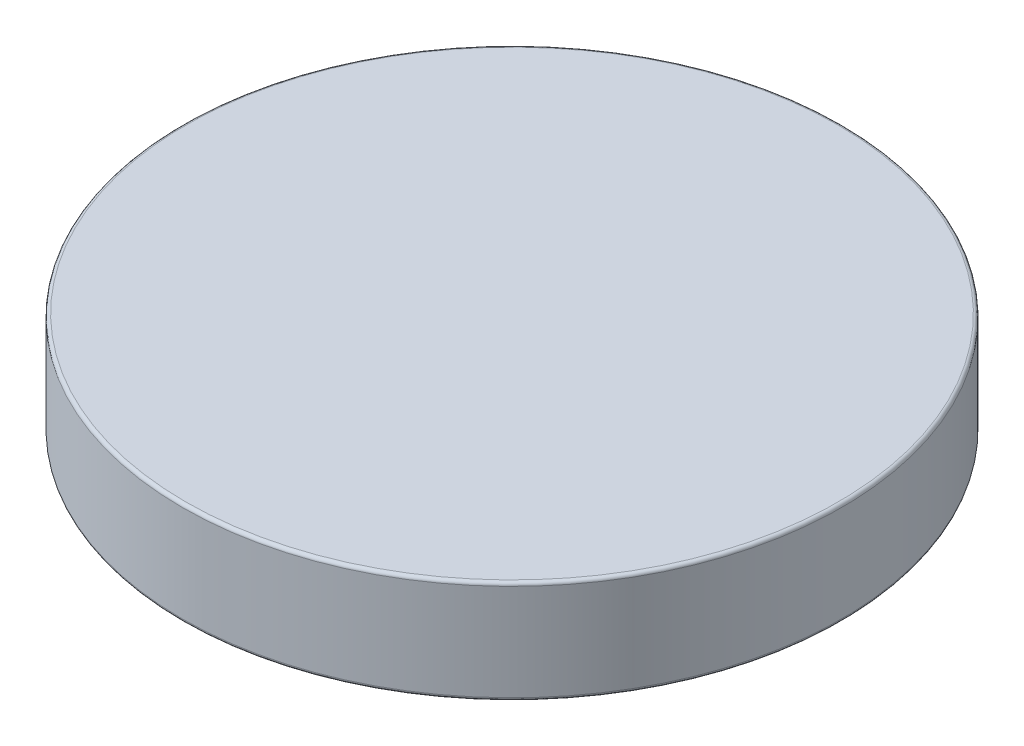
ISO-10303-21;
HEADER;
FILE_DESCRIPTION(('STEP AP214'),'2;1');
FILE_NAME('part.step','',(''),(''),'','','');
FILE_SCHEMA(('AUTOMOTIVE_DESIGN { 1 0 10303 214 1 1 1 1 }'));
ENDSEC;
DATA;
#1=APPLICATION_CONTEXT('core data for automotive mechanical design processes');
#2=APPLICATION_PROTOCOL_DEFINITION('international standard','automotive_design',2000,#1);
#3=PRODUCT_CONTEXT('',#1,'mechanical');
#4=PRODUCT('Part','Part','',(#3));
#5=PRODUCT_RELATED_PRODUCT_CATEGORY('part','',(#4));
#6=PRODUCT_DEFINITION_FORMATION('','',#4);
#7=PRODUCT_DEFINITION_CONTEXT('part definition',#1,'design');
#8=PRODUCT_DEFINITION('design','',#6,#7);
#9=PRODUCT_DEFINITION_SHAPE('','',#8);
#10=(LENGTH_UNIT() NAMED_UNIT(*) SI_UNIT(.MILLI.,.METRE.));
#11=(NAMED_UNIT(*) PLANE_ANGLE_UNIT() SI_UNIT($,.RADIAN.));
#12=(NAMED_UNIT(*) SI_UNIT($,.STERADIAN.) SOLID_ANGLE_UNIT());
#13=UNCERTAINTY_MEASURE_WITH_UNIT(LENGTH_MEASURE(1.E-05),#10,'distance_accuracy_value','');
#14=(GEOMETRIC_REPRESENTATION_CONTEXT(3) GLOBAL_UNCERTAINTY_ASSIGNED_CONTEXT((#13)) GLOBAL_UNIT_ASSIGNED_CONTEXT((#10,
#11,#12)) REPRESENTATION_CONTEXT('',''));
#15=CARTESIAN_POINT('',(0.,0.,0.));
#16=DIRECTION('',(0.,0.,1.));
#17=DIRECTION('',(1.,0.,0.));
#18=AXIS2_PLACEMENT_3D('',#15,#16,#17);
#19=CARTESIAN_POINT('',(0.,0.79375,0.));
#20=DIRECTION('',(0.,-1.,0.));
#21=DIRECTION('',(0.,0.,-1.));
#22=AXIS2_PLACEMENT_3D('',#19,#20,#21);
#23=CYLINDRICAL_SURFACE('',#22,2.54);
#24=CARTESIAN_POINT('',(0.,0.0254,0.));
#25=DIRECTION('',(0.,1.,0.));
#26=DIRECTION('',(0.,0.,1.));
#27=AXIS2_PLACEMENT_3D('',#24,#25,#26);
#28=CIRCLE('',#27,2.54);
#29=CARTESIAN_POINT('',(0.,0.0254,2.54));
#30=VERTEX_POINT('',#29);
#31=EDGE_CURVE('E41',#30,#30,#28,.T.);
#32=ORIENTED_EDGE('',*,*,#31,.T.);
#33=EDGE_LOOP('',(#32));
#34=FACE_BOUND('',#33,.T.);
#35=CARTESIAN_POINT('',(0.,0.76835,0.));
#36=DIRECTION('',(0.,1.,0.));
#37=DIRECTION('',(0.,0.,1.));
#38=AXIS2_PLACEMENT_3D('',#35,#36,#37);
#39=CIRCLE('',#38,2.54);
#40=CARTESIAN_POINT('',(0.,0.76835,2.54));
#41=VERTEX_POINT('',#40);
#42=EDGE_CURVE('E45',#41,#41,#39,.F.);
#43=ORIENTED_EDGE('',*,*,#42,.T.);
#44=EDGE_LOOP('',(#43));
#45=FACE_BOUND('',#44,.T.);
#46=ADVANCED_FACE('F30',(#34,#45),#23,.T.);
#47=CARTESIAN_POINT('',(0.,0.79375,0.));
#48=DIRECTION('',(0.,1.,0.));
#49=DIRECTION('',(0.,0.,1.));
#50=AXIS2_PLACEMENT_3D('',#47,#48,#49);
#51=PLANE('',#50);
#52=CARTESIAN_POINT('',(0.,0.79375,0.));
#53=DIRECTION('',(0.,1.,0.));
#54=DIRECTION('',(0.,0.,1.));
#55=AXIS2_PLACEMENT_3D('',#52,#53,#54);
#56=CIRCLE('',#55,2.5146);
#57=CARTESIAN_POINT('',(0.,0.79375,2.5146));
#58=VERTEX_POINT('',#57);
#59=EDGE_CURVE('E10',#58,#58,#56,.T.);
#60=ORIENTED_EDGE('',*,*,#59,.T.);
#61=EDGE_LOOP('',(#60));
#62=FACE_BOUND('',#61,.T.);
#63=ADVANCED_FACE('F61',(#62),#51,.T.);
#64=CARTESIAN_POINT('',(0.,0.,0.));
#65=DIRECTION('',(0.,1.,0.));
#66=DIRECTION('',(0.,0.,1.));
#67=AXIS2_PLACEMENT_3D('',#64,#65,#66);
#68=PLANE('',#67);
#69=CARTESIAN_POINT('',(0.,0.,0.));
#70=DIRECTION('',(0.,1.,0.));
#71=DIRECTION('',(0.,0.,1.));
#72=AXIS2_PLACEMENT_3D('',#69,#70,#71);
#73=CIRCLE('',#72,2.5146);
#74=CARTESIAN_POINT('',(0.,0.,2.5146));
#75=VERTEX_POINT('',#74);
#76=EDGE_CURVE('E37',#75,#75,#73,.F.);
#77=ORIENTED_EDGE('',*,*,#76,.T.);
#78=EDGE_LOOP('',(#77));
#79=FACE_BOUND('',#78,.T.);
#80=ADVANCED_FACE('F58',(#79),#68,.F.);
#81=CARTESIAN_POINT('',(0.,0.0254,0.));
#82=DIRECTION('',(0.,1.,0.));
#83=DIRECTION('',(0.,0.,1.));
#84=AXIS2_PLACEMENT_3D('',#81,#82,#83);
#85=TOROIDAL_SURFACE('',#84,2.5146,0.0254);
#86=ORIENTED_EDGE('',*,*,#76,.F.);
#87=EDGE_LOOP('',(#86));
#88=FACE_BOUND('',#87,.T.);
#89=ORIENTED_EDGE('',*,*,#31,.F.);
#90=EDGE_LOOP('',(#89));
#91=FACE_BOUND('',#90,.T.);
#92=ADVANCED_FACE('F54',(#88,#91),#85,.T.);
#93=CARTESIAN_POINT('',(0.,0.76835,0.));
#94=DIRECTION('',(0.,1.,0.));
#95=DIRECTION('',(0.,0.,1.));
#96=AXIS2_PLACEMENT_3D('',#93,#94,#95);
#97=TOROIDAL_SURFACE('',#96,2.5146,0.0254);
#98=ORIENTED_EDGE('',*,*,#42,.F.);
#99=EDGE_LOOP('',(#98));
#100=FACE_BOUND('',#99,.T.);
#101=ORIENTED_EDGE('',*,*,#59,.F.);
#102=EDGE_LOOP('',(#101));
#103=FACE_BOUND('',#102,.T.);
#104=ADVANCED_FACE('F32',(#100,#103),#97,.T.);
#105=CLOSED_SHELL('',(#46,#63,#80,#92,#104));
#106=MANIFOLD_SOLID_BREP('B2',#105);
#107=ADVANCED_BREP_SHAPE_REPRESENTATION('',(#18,#106),#14);
#108=SHAPE_DEFINITION_REPRESENTATION(#9,#107);
ENDSEC;
END-ISO-10303-21;
